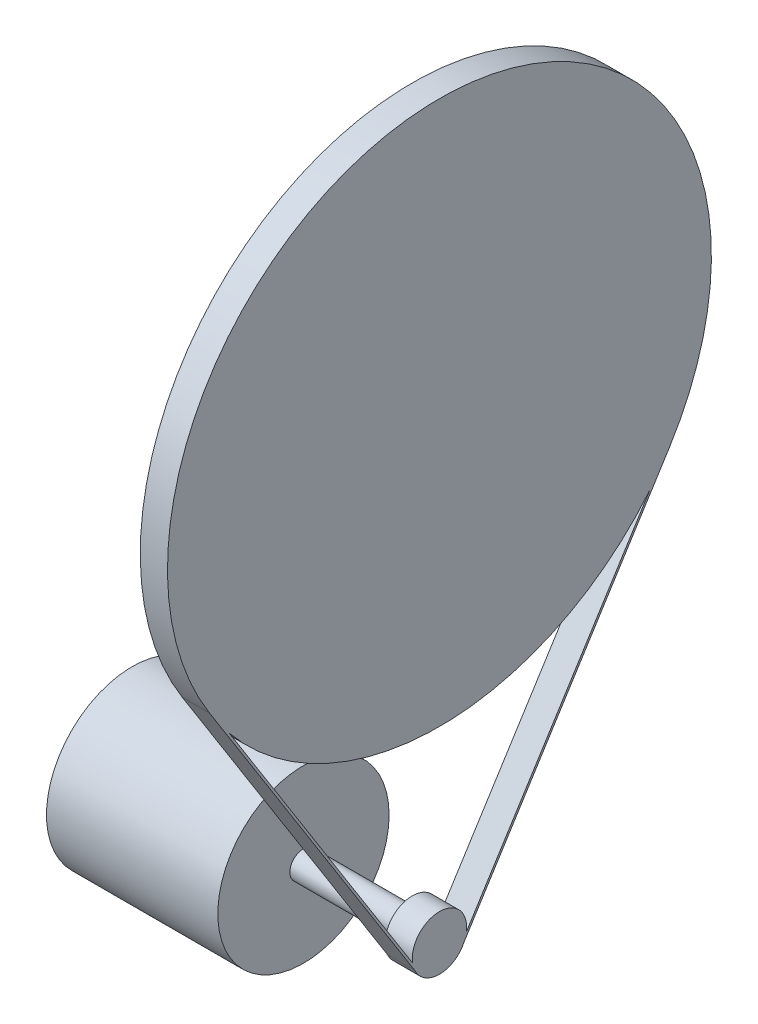
ISO-10303-21;
HEADER;
FILE_DESCRIPTION(('STEP AP214'),'2;1');
FILE_NAME('part.step','',(''),(''),'','','');
FILE_SCHEMA(('AUTOMOTIVE_DESIGN { 1 0 10303 214 1 1 1 1 }'));
ENDSEC;
DATA;
#1=APPLICATION_CONTEXT('core data for automotive mechanical design processes');
#2=APPLICATION_PROTOCOL_DEFINITION('international standard','automotive_design',2000,#1);
#3=PRODUCT_CONTEXT('',#1,'mechanical');
#4=PRODUCT('Part','Part','',(#3));
#5=PRODUCT_RELATED_PRODUCT_CATEGORY('part','',(#4));
#6=PRODUCT_DEFINITION_FORMATION('','',#4);
#7=PRODUCT_DEFINITION_CONTEXT('part definition',#1,'design');
#8=PRODUCT_DEFINITION('design','',#6,#7);
#9=PRODUCT_DEFINITION_SHAPE('','',#8);
#10=(LENGTH_UNIT() NAMED_UNIT(*) SI_UNIT(.MILLI.,.METRE.));
#11=(NAMED_UNIT(*) PLANE_ANGLE_UNIT() SI_UNIT($,.RADIAN.));
#12=(NAMED_UNIT(*) SI_UNIT($,.STERADIAN.) SOLID_ANGLE_UNIT());
#13=UNCERTAINTY_MEASURE_WITH_UNIT(LENGTH_MEASURE(1.E-05),#10,'distance_accuracy_value','');
#14=(GEOMETRIC_REPRESENTATION_CONTEXT(3) GLOBAL_UNCERTAINTY_ASSIGNED_CONTEXT((#13)) GLOBAL_UNIT_ASSIGNED_CONTEXT((#10,
#11,#12)) REPRESENTATION_CONTEXT('',''));
#15=CARTESIAN_POINT('',(0.,0.,0.));
#16=DIRECTION('',(0.,0.,1.));
#17=DIRECTION('',(1.,0.,0.));
#18=AXIS2_PLACEMENT_3D('',#15,#16,#17);
#19=CARTESIAN_POINT('',(143.5,0.,0.));
#20=DIRECTION('',(-1.,0.,0.));
#21=DIRECTION('',(0.,0.,1.));
#22=AXIS2_PLACEMENT_3D('',#19,#20,#21);
#23=CYLINDRICAL_SURFACE('',#22,12.7);
#24=DIRECTION('',(-1.,0.,0.));
#25=VECTOR('',#24,1.);
#26=CARTESIAN_POINT('',(143.5,-1.82954736107985,-12.5675278576801));
#27=LINE('',#26,#25);
#28=CARTESIAN_POINT('',(143.5,-1.82954736107985,-12.5675278576801));
#29=VERTEX_POINT('',#28);
#30=CARTESIAN_POINT('',(130.8,-1.82954736107986,-12.5675278576801));
#31=VERTEX_POINT('',#30);
#32=EDGE_CURVE('E108',#29,#31,#27,.T.);
#33=ORIENTED_EDGE('',*,*,#32,.T.);
#34=CARTESIAN_POINT('',(130.8,0.,0.));
#35=DIRECTION('',(1.,0.,0.));
#36=DIRECTION('',(0.,0.,-1.));
#37=AXIS2_PLACEMENT_3D('',#34,#35,#36);
#38=CIRCLE('',#37,12.7);
#39=CARTESIAN_POINT('',(130.8,-1.82954736107985,12.5675278576801));
#40=VERTEX_POINT('',#39);
#41=EDGE_CURVE('E157',#31,#40,#38,.T.);
#42=ORIENTED_EDGE('',*,*,#41,.T.);
#43=DIRECTION('',(-1.,0.,0.));
#44=VECTOR('',#43,1.);
#45=CARTESIAN_POINT('',(143.5,-1.82954736107985,12.5675278576801));
#46=LINE('',#45,#44);
#47=CARTESIAN_POINT('',(143.5,-1.82954736107986,12.5675278576801));
#48=VERTEX_POINT('',#47);
#49=EDGE_CURVE('E117',#48,#40,#46,.T.);
#50=ORIENTED_EDGE('',*,*,#49,.F.);
#51=CARTESIAN_POINT('',(143.5,0.,0.));
#52=DIRECTION('',(1.,0.,0.));
#53=DIRECTION('',(0.,0.,-1.));
#54=AXIS2_PLACEMENT_3D('',#51,#52,#53);
#55=CIRCLE('',#54,12.7);
#56=EDGE_CURVE('E163',#29,#48,#55,.T.);
#57=ORIENTED_EDGE('',*,*,#56,.F.);
#58=EDGE_LOOP('',(#33,#42,#50,#57));
#59=FACE_BOUND('',#58,.T.);
#60=ADVANCED_FACE('F33',(#59),#23,.T.);
#61=CARTESIAN_POINT('',(80.,0.,0.));
#62=DIRECTION('',(-1.,0.,0.));
#63=DIRECTION('',(0.,0.,1.));
#64=AXIS2_PLACEMENT_3D('',#61,#62,#63);
#65=CYLINDRICAL_SURFACE('',#64,40.);
#66=CARTESIAN_POINT('',(80.,0.,0.));
#67=DIRECTION('',(1.,0.,0.));
#68=DIRECTION('',(0.,0.,-1.));
#69=AXIS2_PLACEMENT_3D('',#66,#67,#68);
#70=CIRCLE('',#69,40.);
#71=CARTESIAN_POINT('',(80.,0.,-40.));
#72=VERTEX_POINT('',#71);
#73=EDGE_CURVE('E42',#72,#72,#70,.T.);
#74=ORIENTED_EDGE('',*,*,#73,.F.);
#75=EDGE_LOOP('',(#74));
#76=FACE_BOUND('',#75,.T.);
#77=CARTESIAN_POINT('',(0.,0.,0.));
#78=DIRECTION('',(1.,0.,0.));
#79=DIRECTION('',(0.,0.,-1.));
#80=AXIS2_PLACEMENT_3D('',#77,#78,#79);
#81=CIRCLE('',#80,40.);
#82=CARTESIAN_POINT('',(0.,0.,-40.));
#83=VERTEX_POINT('',#82);
#84=EDGE_CURVE('E37',#83,#83,#81,.T.);
#85=ORIENTED_EDGE('',*,*,#84,.T.);
#86=EDGE_LOOP('',(#85));
#87=FACE_BOUND('',#86,.T.);
#88=ADVANCED_FACE('F35',(#76,#87),#65,.T.);
#89=CARTESIAN_POINT('',(80.,0.,0.));
#90=DIRECTION('',(1.,0.,0.));
#91=DIRECTION('',(0.,0.,-1.));
#92=AXIS2_PLACEMENT_3D('',#89,#90,#91);
#93=PLANE('',#92);
#94=CARTESIAN_POINT('',(80.,0.,0.));
#95=DIRECTION('',(1.,0.,0.));
#96=DIRECTION('',(0.,0.,-1.));
#97=AXIS2_PLACEMENT_3D('',#94,#95,#96);
#98=CIRCLE('',#97,6.35);
#99=CARTESIAN_POINT('',(80.,0.,-6.35));
#100=VERTEX_POINT('',#99);
#101=EDGE_CURVE('E11',#100,#100,#98,.T.);
#102=ORIENTED_EDGE('',*,*,#101,.F.);
#103=EDGE_LOOP('',(#102));
#104=FACE_BOUND('',#103,.T.);
#105=ORIENTED_EDGE('',*,*,#73,.T.);
#106=EDGE_LOOP('',(#105));
#107=FACE_BOUND('',#106,.T.);
#108=ADVANCED_FACE('F179',(#104,#107),#93,.T.);
#109=CARTESIAN_POINT('',(0.,0.,0.));
#110=DIRECTION('',(1.,0.,0.));
#111=DIRECTION('',(0.,0.,-1.));
#112=AXIS2_PLACEMENT_3D('',#109,#110,#111);
#113=PLANE('',#112);
#114=ORIENTED_EDGE('',*,*,#84,.F.);
#115=EDGE_LOOP('',(#114));
#116=FACE_BOUND('',#115,.T.);
#117=ADVANCED_FACE('F176',(#116),#113,.F.);
#118=CARTESIAN_POINT('',(130.8,0.,0.));
#119=DIRECTION('',(-1.,0.,0.));
#120=DIRECTION('',(0.,0.,1.));
#121=AXIS2_PLACEMENT_3D('',#118,#119,#120);
#122=CYLINDRICAL_SURFACE('',#121,6.35);
#123=CARTESIAN_POINT('',(130.8,0.,0.));
#124=DIRECTION('',(1.,0.,0.));
#125=DIRECTION('',(0.,0.,-1.));
#126=AXIS2_PLACEMENT_3D('',#123,#124,#125);
#127=CIRCLE('',#126,6.35);
#128=CARTESIAN_POINT('',(130.8,0.,-6.35));
#129=VERTEX_POINT('',#128);
#130=EDGE_CURVE('E167',#129,#129,#127,.T.);
#131=ORIENTED_EDGE('',*,*,#130,.F.);
#132=EDGE_LOOP('',(#131));
#133=FACE_BOUND('',#132,.T.);
#134=ORIENTED_EDGE('',*,*,#101,.T.);
#135=EDGE_LOOP('',(#134));
#136=FACE_BOUND('',#135,.T.);
#137=ADVANCED_FACE('F178',(#133,#136),#122,.T.);
#138=CARTESIAN_POINT('',(130.8,-5.42298007867907,11.4839578136743));
#139=VERTEX_POINT('',#138);
#140=CARTESIAN_POINT('',(130.8,-5.42298007867903,-11.4839578136743));
#141=VERTEX_POINT('',#140);
#142=EDGE_CURVE('E165',#139,#141,#38,.T.);
#143=ORIENTED_EDGE('',*,*,#142,.T.);
#144=DIRECTION('',(-1.,0.,0.));
#145=VECTOR('',#144,1.);
#146=CARTESIAN_POINT('',(143.5,-5.42298007867906,-11.4839578136743));
#147=LINE('',#146,#145);
#148=CARTESIAN_POINT('',(143.5,-5.42298007867903,-11.4839578136743));
#149=VERTEX_POINT('',#148);
#150=EDGE_CURVE('E50',#149,#141,#147,.T.);
#151=ORIENTED_EDGE('',*,*,#150,.F.);
#152=CARTESIAN_POINT('',(143.5,-5.42298007867907,11.4839578136743));
#153=VERTEX_POINT('',#152);
#154=EDGE_CURVE('E54',#153,#149,#55,.T.);
#155=ORIENTED_EDGE('',*,*,#154,.F.);
#156=DIRECTION('',(-1.,0.,0.));
#157=VECTOR('',#156,1.);
#158=CARTESIAN_POINT('',(143.5,-5.42298007867906,11.4839578136743));
#159=LINE('',#158,#157);
#160=EDGE_CURVE('E148',#153,#139,#159,.T.);
#161=ORIENTED_EDGE('',*,*,#160,.T.);
#162=EDGE_LOOP('',(#143,#151,#155,#161));
#163=FACE_BOUND('',#162,.T.);
#164=ADVANCED_FACE('F184',(#163),#23,.T.);
#165=CARTESIAN_POINT('',(143.5,0.,0.));
#166=DIRECTION('',(1.,0.,0.));
#167=DIRECTION('',(0.,0.,-1.));
#168=AXIS2_PLACEMENT_3D('',#165,#166,#167);
#169=PLANE('',#168);
#170=DIRECTION('',(0.,-0.845890418577581,0.533356728427274));
#171=VECTOR('',#170,1.);
#172=CARTESIAN_POINT('',(143.5,-1.82954736107985,-12.5675278576801));
#173=LINE('',#172,#171);
#174=CARTESIAN_POINT('',(143.5,133.820646696411,-98.098634634713));
#175=VERTEX_POINT('',#174);
#176=EDGE_CURVE('E113',#175,#29,#173,.T.);
#177=ORIENTED_EDGE('',*,*,#176,.T.);
#178=ORIENTED_EDGE('',*,*,#56,.T.);
#179=DIRECTION('',(0.,0.845890418577581,0.533356728427274));
#180=VECTOR('',#179,1.);
#181=CARTESIAN_POINT('',(143.5,-1.82954736107985,12.5675278576801));
#182=LINE('',#181,#180);
#183=CARTESIAN_POINT('',(143.5,133.820646696411,98.0986346347129));
#184=VERTEX_POINT('',#183);
#185=EDGE_CURVE('E123',#48,#184,#182,.T.);
#186=ORIENTED_EDGE('',*,*,#185,.T.);
#187=CARTESIAN_POINT('',(143.5,214.478305246638,0.));
#188=DIRECTION('',(1.,0.,0.));
#189=DIRECTION('',(0.,0.,1.));
#190=AXIS2_PLACEMENT_3D('',#187,#188,#189);
#191=CIRCLE('',#190,127.);
#192=EDGE_CURVE('E101',#184,#175,#191,.T.);
#193=ORIENTED_EDGE('',*,*,#192,.T.);
#194=EDGE_LOOP('',(#177,#178,#186,#193));
#195=FACE_BOUND('',#194,.T.);
#196=ORIENTED_EDGE('',*,*,#154,.T.);
#197=DIRECTION('',(0.,-0.845890418577581,0.533356728427274));
#198=VECTOR('',#197,1.);
#199=CARTESIAN_POINT('',(143.5,-5.42298007867906,-11.4839578136743));
#200=LINE('',#199,#198);
#201=CARTESIAN_POINT('',(143.5,146.742000736375,-107.428083159353));
#202=VERTEX_POINT('',#201);
#203=EDGE_CURVE('E145',#202,#149,#200,.T.);
#204=ORIENTED_EDGE('',*,*,#203,.F.);
#205=CARTESIAN_POINT('',(143.5,214.478305246638,0.));
#206=DIRECTION('',(-1.,0.,0.));
#207=DIRECTION('',(0.,0.,1.));
#208=AXIS2_PLACEMENT_3D('',#205,#206,#207);
#209=CIRCLE('',#208,127.);
#210=CARTESIAN_POINT('',(143.5,146.742000736375,107.428083159353));
#211=VERTEX_POINT('',#210);
#212=EDGE_CURVE('E141',#211,#202,#209,.T.);
#213=ORIENTED_EDGE('',*,*,#212,.F.);
#214=DIRECTION('',(0.,0.845890418577581,0.533356728427274));
#215=VECTOR('',#214,1.);
#216=CARTESIAN_POINT('',(143.5,-5.42298007867906,11.4839578136743));
#217=LINE('',#216,#215);
#218=EDGE_CURVE('E138',#153,#211,#217,.T.);
#219=ORIENTED_EDGE('',*,*,#218,.F.);
#220=EDGE_LOOP('',(#196,#204,#213,#219));
#221=FACE_BOUND('',#220,.T.);
#222=ADVANCED_FACE('F120',(#195,#221),#169,.T.);
#223=CARTESIAN_POINT('',(130.8,0.,0.));
#224=DIRECTION('',(1.,0.,0.));
#225=DIRECTION('',(0.,0.,-1.));
#226=AXIS2_PLACEMENT_3D('',#223,#224,#225);
#227=PLANE('',#226);
#228=ORIENTED_EDGE('',*,*,#41,.F.);
#229=DIRECTION('',(0.,-0.845890418577581,0.533356728427274));
#230=VECTOR('',#229,1.);
#231=CARTESIAN_POINT('',(130.8,-1.82954736107985,-12.5675278576801));
#232=LINE('',#231,#230);
#233=CARTESIAN_POINT('',(130.8,133.820646696411,-98.098634634713));
#234=VERTEX_POINT('',#233);
#235=EDGE_CURVE('E125',#234,#31,#232,.T.);
#236=ORIENTED_EDGE('',*,*,#235,.F.);
#237=CARTESIAN_POINT('',(130.8,214.478305246638,0.));
#238=DIRECTION('',(1.,0.,0.));
#239=DIRECTION('',(0.,0.,1.));
#240=AXIS2_PLACEMENT_3D('',#237,#238,#239);
#241=CIRCLE('',#240,127.);
#242=CARTESIAN_POINT('',(130.8,133.820646696411,98.0986346347129));
#243=VERTEX_POINT('',#242);
#244=EDGE_CURVE('E104',#243,#234,#241,.T.);
#245=ORIENTED_EDGE('',*,*,#244,.F.);
#246=DIRECTION('',(0.,0.845890418577581,0.533356728427274));
#247=VECTOR('',#246,1.);
#248=CARTESIAN_POINT('',(130.8,-1.82954736107985,12.5675278576801));
#249=LINE('',#248,#247);
#250=EDGE_CURVE('E128',#40,#243,#249,.T.);
#251=ORIENTED_EDGE('',*,*,#250,.F.);
#252=EDGE_LOOP('',(#228,#236,#245,#251));
#253=FACE_BOUND('',#252,.T.);
#254=ORIENTED_EDGE('',*,*,#130,.T.);
#255=EDGE_LOOP('',(#254));
#256=FACE_BOUND('',#255,.T.);
#257=ORIENTED_EDGE('',*,*,#142,.F.);
#258=DIRECTION('',(0.,0.845890418577581,0.533356728427274));
#259=VECTOR('',#258,1.);
#260=CARTESIAN_POINT('',(130.8,-5.42298007867906,11.4839578136743));
#261=LINE('',#260,#259);
#262=CARTESIAN_POINT('',(130.8,146.742000736375,107.428083159353));
#263=VERTEX_POINT('',#262);
#264=EDGE_CURVE('E133',#139,#263,#261,.T.);
#265=ORIENTED_EDGE('',*,*,#264,.T.);
#266=CARTESIAN_POINT('',(130.8,214.478305246638,0.));
#267=DIRECTION('',(-1.,0.,0.));
#268=DIRECTION('',(0.,0.,1.));
#269=AXIS2_PLACEMENT_3D('',#266,#267,#268);
#270=CIRCLE('',#269,127.);
#271=CARTESIAN_POINT('',(130.8,146.742000736375,-107.428083159353));
#272=VERTEX_POINT('',#271);
#273=EDGE_CURVE('E151',#263,#272,#270,.T.);
#274=ORIENTED_EDGE('',*,*,#273,.T.);
#275=DIRECTION('',(0.,-0.845890418577581,0.533356728427274));
#276=VECTOR('',#275,1.);
#277=CARTESIAN_POINT('',(130.8,-5.42298007867906,-11.4839578136743));
#278=LINE('',#277,#276);
#279=EDGE_CURVE('E142',#272,#141,#278,.T.);
#280=ORIENTED_EDGE('',*,*,#279,.T.);
#281=EDGE_LOOP('',(#257,#265,#274,#280));
#282=FACE_BOUND('',#281,.T.);
#283=ADVANCED_FACE('F201',(#253,#256,#282),#227,.F.);
#284=CARTESIAN_POINT('',(143.5,-5.42298007867906,-11.4839578136743));
#285=DIRECTION('',(0.,-0.533356728427274,-0.845890418577581));
#286=DIRECTION('',(0.,0.845890418577581,-0.533356728427274));
#287=AXIS2_PLACEMENT_3D('',#284,#285,#286);
#288=PLANE('',#287);
#289=ORIENTED_EDGE('',*,*,#279,.F.);
#290=DIRECTION('',(-1.,0.,0.));
#291=VECTOR('',#290,1.);
#292=CARTESIAN_POINT('',(143.5,146.742000736375,-107.428083159353));
#293=LINE('',#292,#291);
#294=EDGE_CURVE('E158',#202,#272,#293,.T.);
#295=ORIENTED_EDGE('',*,*,#294,.F.);
#296=ORIENTED_EDGE('',*,*,#203,.T.);
#297=ORIENTED_EDGE('',*,*,#150,.T.);
#298=EDGE_LOOP('',(#289,#295,#296,#297));
#299=FACE_BOUND('',#298,.T.);
#300=ADVANCED_FACE('F208',(#299),#288,.T.);
#301=CARTESIAN_POINT('',(143.5,214.478305246638,0.));
#302=DIRECTION('',(-1.,0.,0.));
#303=DIRECTION('',(0.,0.,1.));
#304=AXIS2_PLACEMENT_3D('',#301,#302,#303);
#305=CYLINDRICAL_SURFACE('',#304,127.);
#306=ORIENTED_EDGE('',*,*,#273,.F.);
#307=DIRECTION('',(-1.,0.,0.));
#308=VECTOR('',#307,1.);
#309=CARTESIAN_POINT('',(143.5,146.742000736375,107.428083159353));
#310=LINE('',#309,#308);
#311=EDGE_CURVE('E160',#211,#263,#310,.T.);
#312=ORIENTED_EDGE('',*,*,#311,.F.);
#313=ORIENTED_EDGE('',*,*,#212,.T.);
#314=ORIENTED_EDGE('',*,*,#294,.T.);
#315=EDGE_LOOP('',(#306,#312,#313,#314));
#316=FACE_BOUND('',#315,.T.);
#317=ADVANCED_FACE('F212',(#316),#305,.T.);
#318=CARTESIAN_POINT('',(143.5,-5.42298007867906,11.4839578136743));
#319=DIRECTION('',(0.,-0.533356728427274,0.845890418577581));
#320=DIRECTION('',(0.,-0.845890418577581,-0.533356728427274));
#321=AXIS2_PLACEMENT_3D('',#318,#319,#320);
#322=PLANE('',#321);
#323=ORIENTED_EDGE('',*,*,#264,.F.);
#324=ORIENTED_EDGE('',*,*,#160,.F.);
#325=ORIENTED_EDGE('',*,*,#218,.T.);
#326=ORIENTED_EDGE('',*,*,#311,.T.);
#327=EDGE_LOOP('',(#323,#324,#325,#326));
#328=FACE_BOUND('',#327,.T.);
#329=ADVANCED_FACE('F216',(#328),#322,.T.);
#330=CARTESIAN_POINT('',(143.5,-1.82954736107985,-12.5675278576801));
#331=DIRECTION('',(0.,-0.533356728427274,-0.845890418577581));
#332=DIRECTION('',(0.,0.845890418577581,-0.533356728427274));
#333=AXIS2_PLACEMENT_3D('',#330,#331,#332);
#334=PLANE('',#333);
#335=ORIENTED_EDGE('',*,*,#235,.T.);
#336=ORIENTED_EDGE('',*,*,#32,.F.);
#337=ORIENTED_EDGE('',*,*,#176,.F.);
#338=DIRECTION('',(-1.,0.,0.));
#339=VECTOR('',#338,1.);
#340=CARTESIAN_POINT('',(143.5,133.820646696411,-98.098634634713));
#341=LINE('',#340,#339);
#342=EDGE_CURVE('E97',#175,#234,#341,.T.);
#343=ORIENTED_EDGE('',*,*,#342,.T.);
#344=EDGE_LOOP('',(#335,#336,#337,#343));
#345=FACE_BOUND('',#344,.T.);
#346=ADVANCED_FACE('F114',(#345),#334,.F.);
#347=CARTESIAN_POINT('',(143.5,214.478305246638,0.));
#348=DIRECTION('',(-1.,0.,0.));
#349=DIRECTION('',(0.,0.,1.));
#350=AXIS2_PLACEMENT_3D('',#347,#348,#349);
#351=CYLINDRICAL_SURFACE('',#350,127.);
#352=ORIENTED_EDGE('',*,*,#244,.T.);
#353=ORIENTED_EDGE('',*,*,#342,.F.);
#354=ORIENTED_EDGE('',*,*,#192,.F.);
#355=DIRECTION('',(-1.,0.,0.));
#356=VECTOR('',#355,1.);
#357=CARTESIAN_POINT('',(143.5,133.820646696411,98.0986346347129));
#358=LINE('',#357,#356);
#359=EDGE_CURVE('E109',#184,#243,#358,.T.);
#360=ORIENTED_EDGE('',*,*,#359,.T.);
#361=EDGE_LOOP('',(#352,#353,#354,#360));
#362=FACE_BOUND('',#361,.T.);
#363=ADVANCED_FACE('F99',(#362),#351,.T.);
#364=CARTESIAN_POINT('',(143.5,-1.82954736107985,12.5675278576801));
#365=DIRECTION('',(0.,-0.533356728427274,0.845890418577581));
#366=DIRECTION('',(0.,-0.845890418577581,-0.533356728427274));
#367=AXIS2_PLACEMENT_3D('',#364,#365,#366);
#368=PLANE('',#367);
#369=ORIENTED_EDGE('',*,*,#250,.T.);
#370=ORIENTED_EDGE('',*,*,#359,.F.);
#371=ORIENTED_EDGE('',*,*,#185,.F.);
#372=ORIENTED_EDGE('',*,*,#49,.T.);
#373=EDGE_LOOP('',(#369,#370,#371,#372));
#374=FACE_BOUND('',#373,.T.);
#375=ADVANCED_FACE('F238',(#374),#368,.F.);
#376=CLOSED_SHELL('',(#60,#88,#108,#117,#137,#164,#222,#283,#300,#317,#329,#346,#363,#375));
#377=MANIFOLD_SOLID_BREP('B2',#376);
#378=ADVANCED_BREP_SHAPE_REPRESENTATION('',(#18,#377),#14);
#379=SHAPE_DEFINITION_REPRESENTATION(#9,#378);
ENDSEC;
END-ISO-10303-21;
